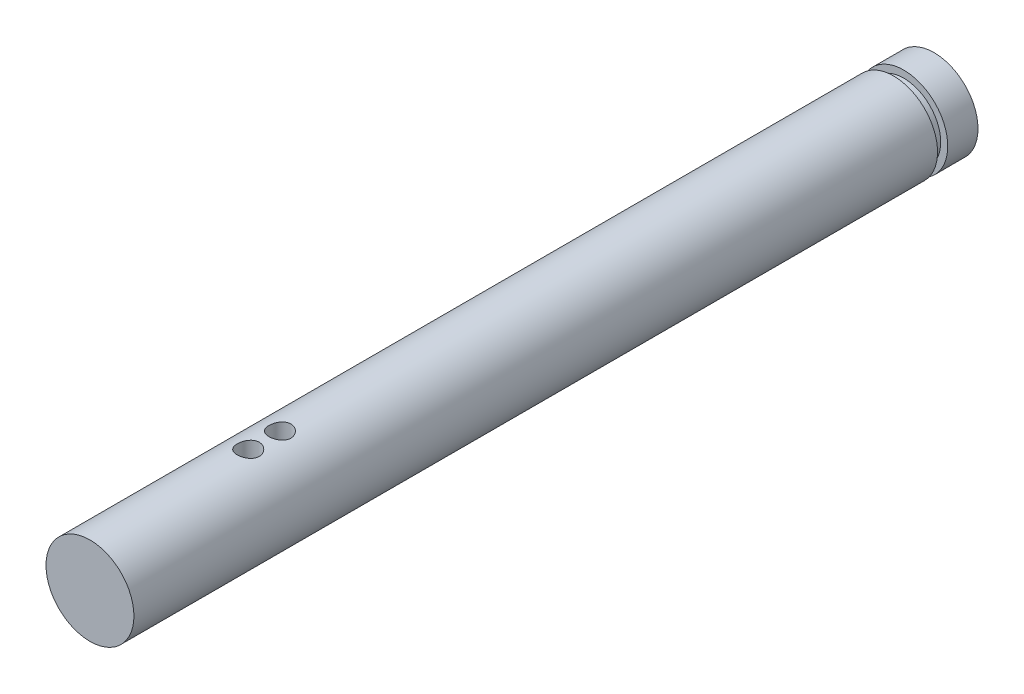
ISO-10303-21;
HEADER;
FILE_DESCRIPTION(('STEP AP214'),'2;1');
FILE_NAME('part.step','',(''),(''),'','','');
FILE_SCHEMA(('AUTOMOTIVE_DESIGN { 1 0 10303 214 1 1 1 1 }'));
ENDSEC;
DATA;
#1=APPLICATION_CONTEXT('core data for automotive mechanical design processes');
#2=APPLICATION_PROTOCOL_DEFINITION('international standard','automotive_design',2000,#1);
#3=PRODUCT_CONTEXT('',#1,'mechanical');
#4=PRODUCT('Part','Part','',(#3));
#5=PRODUCT_RELATED_PRODUCT_CATEGORY('part','',(#4));
#6=PRODUCT_DEFINITION_FORMATION('','',#4);
#7=PRODUCT_DEFINITION_CONTEXT('part definition',#1,'design');
#8=PRODUCT_DEFINITION('design','',#6,#7);
#9=PRODUCT_DEFINITION_SHAPE('','',#8);
#10=(LENGTH_UNIT() NAMED_UNIT(*) SI_UNIT(.MILLI.,.METRE.));
#11=(NAMED_UNIT(*) PLANE_ANGLE_UNIT() SI_UNIT($,.RADIAN.));
#12=(NAMED_UNIT(*) SI_UNIT($,.STERADIAN.) SOLID_ANGLE_UNIT());
#13=UNCERTAINTY_MEASURE_WITH_UNIT(LENGTH_MEASURE(1.E-05),#10,'distance_accuracy_value','');
#14=(GEOMETRIC_REPRESENTATION_CONTEXT(3) GLOBAL_UNCERTAINTY_ASSIGNED_CONTEXT((#13)) GLOBAL_UNIT_ASSIGNED_CONTEXT((#10,
#11,#12)) REPRESENTATION_CONTEXT('',''));
#15=CARTESIAN_POINT('',(0.,0.,0.));
#16=DIRECTION('',(0.,0.,1.));
#17=DIRECTION('',(1.,0.,0.));
#18=AXIS2_PLACEMENT_3D('',#15,#16,#17);
#19=CARTESIAN_POINT('',(0.,0.,35.56));
#20=DIRECTION('',(0.,0.,-1.));
#21=DIRECTION('',(-1.,0.,0.));
#22=AXIS2_PLACEMENT_3D('',#19,#20,#21);
#23=CYLINDRICAL_SURFACE('',#22,3.175);
#24=CARTESIAN_POINT('',(0.,-3.175,50.32375));
#25=CARTESIAN_POINT('',(0.0438552635877331,-3.17499925846823,50.3237487692969));
#26=CARTESIAN_POINT('',(0.0877242751854461,-3.17408230928092,50.3201032210489));
#27=CARTESIAN_POINT('',(0.174205012995241,-3.17051326901651,50.3056391907667));
#28=CARTESIAN_POINT('',(0.216816012302433,-3.167860194514,50.2948166432862));
#29=CARTESIAN_POINT('',(0.299519378196613,-3.16111268934038,50.2663675617096));
#30=CARTESIAN_POINT('',(0.339614702315041,-3.15701999003938,50.2487491981798));
#31=CARTESIAN_POINT('',(0.416280669799424,-3.14782911098185,50.2072373477679));
#32=CARTESIAN_POINT('',(0.452851194217885,-3.14273089731102,50.1833436492204));
#33=CARTESIAN_POINT('',(0.52218268653007,-3.13196506358995,50.1294395821413));
#34=CARTESIAN_POINT('',(0.554860719323982,-3.12628865866099,50.0993242915841));
#35=CARTESIAN_POINT('',(0.614758807311746,-3.11506457312193,50.034056541569));
#36=CARTESIAN_POINT('',(0.641978246218915,-3.10951690710918,49.9989035141075));
#37=CARTESIAN_POINT('',(0.690576545564486,-3.0990898547443,49.9239141925181));
#38=CARTESIAN_POINT('',(0.711862630927166,-3.09422162074029,49.8840160820295));
#39=CARTESIAN_POINT('',(0.747393364107986,-3.08583274338135,49.8010664654974));
#40=CARTESIAN_POINT('',(0.761639137669979,-3.08231188460184,49.7580154648651));
#41=CARTESIAN_POINT('',(0.782401934475602,-3.07710668929704,49.6708940655345));
#42=CARTESIAN_POINT('',(0.78906807532639,-3.07538697360746,49.626861367507));
#43=CARTESIAN_POINT('',(0.794946855973403,-3.07387287676221,49.5382716322301));
#44=CARTESIAN_POINT('',(0.794160708378678,-3.07407818237407,49.4937146814636));
#45=CARTESIAN_POINT('',(0.785276202621617,-3.07635912908627,49.4064841350685));
#46=CARTESIAN_POINT('',(0.777355538350815,-3.07838931671828,49.3637910669747));
#47=CARTESIAN_POINT('',(0.754710298902891,-3.08401883870473,49.2803597772261));
#48=CARTESIAN_POINT('',(0.739985239011734,-3.08761828484494,49.2396216950638));
#49=CARTESIAN_POINT('',(0.703997765408409,-3.09602247774299,49.1607802997333));
#50=CARTESIAN_POINT('',(0.682670861410749,-3.10083902452569,49.1227077340947));
#51=CARTESIAN_POINT('',(0.634130196057914,-3.11112805322879,49.050618016087));
#52=CARTESIAN_POINT('',(0.606915404578009,-3.11660064985464,49.0166015749811));
#53=CARTESIAN_POINT('',(0.546451062227141,-3.12777653452301,48.9525714200284));
#54=CARTESIAN_POINT('',(0.513051561612766,-3.1334819509876,48.9226994990092));
#55=CARTESIAN_POINT('',(0.441648806345707,-3.14433990118774,48.8689537591962));
#56=CARTESIAN_POINT('',(0.403645411120452,-3.14949241803232,48.8450801236188));
#57=CARTESIAN_POINT('',(0.323911324427233,-3.15868966566505,48.8039565647896));
#58=CARTESIAN_POINT('',(0.282168278906226,-3.16273053067588,48.7867296741154));
#59=CARTESIAN_POINT('',(0.196255220975606,-3.16922106074626,48.7595770923953));
#60=CARTESIAN_POINT('',(0.152085674550463,-3.17167103017036,48.7496500047287));
#61=CARTESIAN_POINT('',(0.0637857343313886,-3.17465868364436,48.7375953715584));
#62=CARTESIAN_POINT('',(0.0196832643270936,-3.17524369981464,48.7352747320352));
#63=CARTESIAN_POINT('',(-0.0682798962491322,-3.17457034214314,48.7379692635877));
#64=CARTESIAN_POINT('',(-0.112140608228599,-3.1733121342381,48.7429837743145));
#65=CARTESIAN_POINT('',(-0.19770421722756,-3.1691240334656,48.7600471056904));
#66=CARTESIAN_POINT('',(-0.239429458787632,-3.16621918923325,48.7719905852566));
#67=CARTESIAN_POINT('',(-0.320281983922786,-3.15906523927229,48.8024524986317));
#68=CARTESIAN_POINT('',(-0.359409004654768,-3.15481599779068,48.820971596449));
#69=CARTESIAN_POINT('',(-0.434722658635794,-3.14533125444339,48.8644332848629));
#70=CARTESIAN_POINT('',(-0.470844796304794,-3.14007958981668,48.8894840261433));
#71=CARTESIAN_POINT('',(-0.538441166386218,-3.12919802778343,48.9451596600717));
#72=CARTESIAN_POINT('',(-0.569914594956549,-3.12356806520694,48.9757855147139));
#73=CARTESIAN_POINT('',(-0.628115842271819,-3.11239406391741,49.0426385376135));
#74=CARTESIAN_POINT('',(-0.654708213283325,-3.10685552632436,49.0789847428388));
#75=CARTESIAN_POINT('',(-0.701416109977552,-3.09664564807955,49.1557376857381));
#76=CARTESIAN_POINT('',(-0.721531923158573,-3.09197426893801,49.1961442430662));
#77=CARTESIAN_POINT('',(-0.754565960072415,-3.0840790846376,49.2796542781102));
#78=CARTESIAN_POINT('',(-0.767526826562774,-3.08084672591967,49.3227400366654));
#79=CARTESIAN_POINT('',(-0.78599541172554,-3.07618735414389,49.410572183383));
#80=CARTESIAN_POINT('',(-0.791504760374121,-3.074759946268,49.4553182061713));
#81=CARTESIAN_POINT('',(-0.794828754051737,-3.07390218553761,49.5438223751234));
#82=CARTESIAN_POINT('',(-0.792859887575311,-3.0744156440204,49.5875719760868));
#83=CARTESIAN_POINT('',(-0.78177880977389,-3.07725185183317,49.6740941410868));
#84=CARTESIAN_POINT('',(-0.772666742005079,-3.07957456480274,49.7168667247405));
#85=CARTESIAN_POINT('',(-0.747676156538475,-3.08573625444607,49.7999853095888));
#86=CARTESIAN_POINT('',(-0.731838243310028,-3.08956612229214,49.8403442406896));
#87=CARTESIAN_POINT('',(-0.693877683449347,-3.09831187404389,49.9178608483526));
#88=CARTESIAN_POINT('',(-0.671754165143089,-3.10322790855576,49.9550180799781));
#89=CARTESIAN_POINT('',(-0.621171683653817,-3.11375231464442,50.0261226578469));
#90=CARTESIAN_POINT('',(-0.592562507041068,-3.11937540140138,50.0599609846868));
#91=CARTESIAN_POINT('',(-0.530113542254567,-3.1305924775116,50.1224269778709));
#92=CARTESIAN_POINT('',(-0.496272513750686,-3.13618645963902,50.1510534051014));
#93=CARTESIAN_POINT('',(-0.423580764630118,-3.14683592780222,50.2027884841154));
#94=CARTESIAN_POINT('',(-0.384650415142421,-3.15187982656105,50.2257878164012));
#95=CARTESIAN_POINT('',(-0.303353289824295,-3.16073856132667,50.264878865806));
#96=CARTESIAN_POINT('',(-0.260989002318608,-3.16455427751551,50.2809755325098));
#97=CARTESIAN_POINT('',(-0.182250425674669,-3.16996264853432,50.3034150935494));
#98=CARTESIAN_POINT('',(-0.146251173772186,-3.17183867923715,50.3110241994491));
#99=CARTESIAN_POINT('',(-0.0735044628546167,-3.17435761935239,50.3211919784999));
#100=CARTESIAN_POINT('',(-0.0367570603242178,-3.17500062151098,50.3237510315074));
#101=CARTESIAN_POINT('',(0.,-3.175,50.32375));
#102=B_SPLINE_CURVE_WITH_KNOTS('',3,(#24,#25,#26,#27,#28,#29,#30,#31,#32,#33,#34,#35,#36,#37,
#38,#39,#40,#41,#42,#43,#44,#45,#46,#47,#48,#49,#50,#51,#52,#53,#54,#55,#56,#57,#58,#59,#60,#61,
#62,#63,#64,#65,#66,#67,#68,#69,#70,#71,#72,#73,#74,#75,#76,#77,#78,#79,#80,#81,#82,#83,#84,#85,
#86,#87,#88,#89,#90,#91,#92,#93,#94,#95,#96,#97,#98,#99,#100,#101),.UNSPECIFIED.,.T.,.F.,(4,2,2,
2,2,2,2,2,2,2,2,2,2,2,2,2,2,2,2,2,2,2,2,2,2,2,2,2,2,2,2,2,2,2,2,2,2,2,4),(0.,0.131431089516375,
0.262936692483397,0.39428467745973,0.525637093339601,0.659418054188193,0.79321411069449,
0.928997843263224,1.06475985702124,1.19780206156782,1.33082261834635,1.46061904666214,
1.59042472250779,1.72154070999927,1.85267965567469,1.98755794262772,2.12244034891239,
2.25778604517323,2.39310583993573,2.52496271818992,2.65680772672159,2.78669895263677,
2.91660329874711,3.04881273419998,3.18104500425076,3.31652302787368,3.45199503671614,
3.58665068066593,3.72127686471065,3.85203583794265,3.98279218339235,4.11277011962706,
4.24276608972442,4.3761531751691,4.50957193170179,4.64540698160197,4.78114446688796,
4.89131103556886,5.00146931739441),.UNSPECIFIED.);
#103=CARTESIAN_POINT('',(0.,-3.175,50.32375));
#104=VERTEX_POINT('',#103);
#105=EDGE_CURVE('E10',#104,#104,#102,.T.);
#106=ORIENTED_EDGE('',*,*,#105,.T.);
#107=EDGE_LOOP('',(#106));
#108=FACE_BOUND('',#107,.T.);
#109=CARTESIAN_POINT('',(0.,3.175,50.32375));
#110=CARTESIAN_POINT('',(-0.0438552635877331,3.17499925846823,50.3237487692969));
#111=CARTESIAN_POINT('',(-0.0877242751854461,3.17408230928092,50.3201032210489));
#112=CARTESIAN_POINT('',(-0.174205012995241,3.17051326901651,50.3056391907667));
#113=CARTESIAN_POINT('',(-0.216816012302433,3.167860194514,50.2948166432862));
#114=CARTESIAN_POINT('',(-0.299519378196613,3.16111268934038,50.2663675617096));
#115=CARTESIAN_POINT('',(-0.339614702315041,3.15701999003938,50.2487491981798));
#116=CARTESIAN_POINT('',(-0.416280669799424,3.14782911098185,50.2072373477679));
#117=CARTESIAN_POINT('',(-0.452851194217885,3.14273089731102,50.1833436492204));
#118=CARTESIAN_POINT('',(-0.52218268653007,3.13196506358995,50.1294395821413));
#119=CARTESIAN_POINT('',(-0.554860719323982,3.12628865866099,50.0993242915841));
#120=CARTESIAN_POINT('',(-0.614758807311746,3.11506457312193,50.034056541569));
#121=CARTESIAN_POINT('',(-0.641978246218915,3.10951690710918,49.9989035141075));
#122=CARTESIAN_POINT('',(-0.690576545564486,3.0990898547443,49.9239141925181));
#123=CARTESIAN_POINT('',(-0.711862630927166,3.09422162074029,49.8840160820295));
#124=CARTESIAN_POINT('',(-0.747393364107986,3.08583274338135,49.8010664654974));
#125=CARTESIAN_POINT('',(-0.761639137669979,3.08231188460184,49.7580154648651));
#126=CARTESIAN_POINT('',(-0.782401934475602,3.07710668929704,49.6708940655345));
#127=CARTESIAN_POINT('',(-0.78906807532639,3.07538697360746,49.626861367507));
#128=CARTESIAN_POINT('',(-0.794946855973403,3.07387287676221,49.5382716322301));
#129=CARTESIAN_POINT('',(-0.794160708378678,3.07407818237407,49.4937146814636));
#130=CARTESIAN_POINT('',(-0.785276202621617,3.07635912908627,49.4064841350685));
#131=CARTESIAN_POINT('',(-0.777355538350815,3.07838931671828,49.3637910669747));
#132=CARTESIAN_POINT('',(-0.754710298902891,3.08401883870473,49.2803597772261));
#133=CARTESIAN_POINT('',(-0.739985239011734,3.08761828484494,49.2396216950638));
#134=CARTESIAN_POINT('',(-0.703997765408409,3.09602247774299,49.1607802997333));
#135=CARTESIAN_POINT('',(-0.682670861410749,3.10083902452569,49.1227077340947));
#136=CARTESIAN_POINT('',(-0.634130196057914,3.11112805322879,49.050618016087));
#137=CARTESIAN_POINT('',(-0.606915404578009,3.11660064985464,49.0166015749811));
#138=CARTESIAN_POINT('',(-0.546451062227141,3.12777653452301,48.9525714200284));
#139=CARTESIAN_POINT('',(-0.513051561612766,3.1334819509876,48.9226994990092));
#140=CARTESIAN_POINT('',(-0.441648806345707,3.14433990118774,48.8689537591962));
#141=CARTESIAN_POINT('',(-0.403645411120452,3.14949241803232,48.8450801236188));
#142=CARTESIAN_POINT('',(-0.323911324427233,3.15868966566505,48.8039565647896));
#143=CARTESIAN_POINT('',(-0.282168278906226,3.16273053067588,48.7867296741154));
#144=CARTESIAN_POINT('',(-0.196255220975606,3.16922106074626,48.7595770923953));
#145=CARTESIAN_POINT('',(-0.152085674550463,3.17167103017036,48.7496500047287));
#146=CARTESIAN_POINT('',(-0.0637857343313886,3.17465868364436,48.7375953715584));
#147=CARTESIAN_POINT('',(-0.0196832643270936,3.17524369981464,48.7352747320352));
#148=CARTESIAN_POINT('',(0.0682798962491322,3.17457034214314,48.7379692635877));
#149=CARTESIAN_POINT('',(0.112140608228599,3.1733121342381,48.7429837743145));
#150=CARTESIAN_POINT('',(0.19770421722756,3.1691240334656,48.7600471056904));
#151=CARTESIAN_POINT('',(0.239429458787632,3.16621918923325,48.7719905852566));
#152=CARTESIAN_POINT('',(0.320281983922786,3.15906523927229,48.8024524986317));
#153=CARTESIAN_POINT('',(0.359409004654768,3.15481599779068,48.820971596449));
#154=CARTESIAN_POINT('',(0.434722658635794,3.14533125444339,48.8644332848629));
#155=CARTESIAN_POINT('',(0.470844796304794,3.14007958981668,48.8894840261433));
#156=CARTESIAN_POINT('',(0.538441166386218,3.12919802778343,48.9451596600717));
#157=CARTESIAN_POINT('',(0.569914594956549,3.12356806520694,48.9757855147139));
#158=CARTESIAN_POINT('',(0.628115842271819,3.11239406391741,49.0426385376135));
#159=CARTESIAN_POINT('',(0.654708213283325,3.10685552632436,49.0789847428388));
#160=CARTESIAN_POINT('',(0.701416109977552,3.09664564807955,49.1557376857381));
#161=CARTESIAN_POINT('',(0.721531923158573,3.09197426893801,49.1961442430662));
#162=CARTESIAN_POINT('',(0.754565960072415,3.0840790846376,49.2796542781102));
#163=CARTESIAN_POINT('',(0.767526826562774,3.08084672591967,49.3227400366654));
#164=CARTESIAN_POINT('',(0.78599541172554,3.07618735414389,49.410572183383));
#165=CARTESIAN_POINT('',(0.791504760374121,3.074759946268,49.4553182061713));
#166=CARTESIAN_POINT('',(0.794828754051737,3.07390218553761,49.5438223751234));
#167=CARTESIAN_POINT('',(0.792859887575311,3.0744156440204,49.5875719760868));
#168=CARTESIAN_POINT('',(0.78177880977389,3.07725185183317,49.6740941410868));
#169=CARTESIAN_POINT('',(0.772666742005079,3.07957456480274,49.7168667247405));
#170=CARTESIAN_POINT('',(0.747676156538475,3.08573625444607,49.7999853095888));
#171=CARTESIAN_POINT('',(0.731838243310028,3.08956612229214,49.8403442406896));
#172=CARTESIAN_POINT('',(0.693877683449347,3.09831187404389,49.9178608483526));
#173=CARTESIAN_POINT('',(0.671754165143089,3.10322790855576,49.9550180799781));
#174=CARTESIAN_POINT('',(0.621171683653817,3.11375231464442,50.0261226578469));
#175=CARTESIAN_POINT('',(0.592562507041068,3.11937540140138,50.0599609846868));
#176=CARTESIAN_POINT('',(0.530113542254567,3.1305924775116,50.1224269778709));
#177=CARTESIAN_POINT('',(0.496272513750686,3.13618645963902,50.1510534051014));
#178=CARTESIAN_POINT('',(0.423580764630118,3.14683592780222,50.2027884841154));
#179=CARTESIAN_POINT('',(0.384650415142421,3.15187982656105,50.2257878164012));
#180=CARTESIAN_POINT('',(0.303353289824295,3.16073856132667,50.264878865806));
#181=CARTESIAN_POINT('',(0.260989002318608,3.16455427751551,50.2809755325098));
#182=CARTESIAN_POINT('',(0.182250425674669,3.16996264853432,50.3034150935494));
#183=CARTESIAN_POINT('',(0.146251173772186,3.17183867923715,50.3110241994491));
#184=CARTESIAN_POINT('',(0.0735044628546167,3.17435761935239,50.3211919784999));
#185=CARTESIAN_POINT('',(0.0367570603242178,3.17500062151098,50.3237510315074));
#186=CARTESIAN_POINT('',(0.,3.175,50.32375));
#187=B_SPLINE_CURVE_WITH_KNOTS('',3,(#109,#110,#111,#112,#113,#114,#115,#116,#117,#118,#119,
#120,#121,#122,#123,#124,#125,#126,#127,#128,#129,#130,#131,#132,#133,#134,#135,#136,#137,#138,
#139,#140,#141,#142,#143,#144,#145,#146,#147,#148,#149,#150,#151,#152,#153,#154,#155,#156,#157,
#158,#159,#160,#161,#162,#163,#164,#165,#166,#167,#168,#169,#170,#171,#172,#173,#174,#175,#176,
#177,#178,#179,#180,#181,#182,#183,#184,#185,#186),.UNSPECIFIED.,.T.,.F.,(4,2,2,2,2,2,2,2,2,2,2,
2,2,2,2,2,2,2,2,2,2,2,2,2,2,2,2,2,2,2,2,2,2,2,2,2,2,2,4),(0.,0.131431089516375,
0.262936692483397,0.39428467745973,0.525637093339601,0.659418054188193,0.79321411069449,
0.928997843263224,1.06475985702124,1.19780206156782,1.33082261834635,1.46061904666214,
1.59042472250779,1.72154070999927,1.85267965567469,1.98755794262772,2.12244034891239,
2.25778604517323,2.39310583993573,2.52496271818992,2.65680772672159,2.78669895263677,
2.91660329874711,3.04881273419998,3.18104500425076,3.31652302787368,3.45199503671614,
3.58665068066593,3.72127686471065,3.85203583794265,3.98279218339235,4.11277011962706,
4.24276608972442,4.3761531751691,4.50957193170179,4.64540698160197,4.78114446688796,
4.89131103556886,5.00146931739441),.UNSPECIFIED.);
#188=CARTESIAN_POINT('',(0.,3.175,50.32375));
#189=VERTEX_POINT('',#188);
#190=EDGE_CURVE('E44',#189,#189,#187,.T.);
#191=ORIENTED_EDGE('',*,*,#190,.T.);
#192=EDGE_LOOP('',(#191));
#193=FACE_BOUND('',#192,.T.);
#194=CARTESIAN_POINT('',(0.,-3.175,48.03775));
#195=CARTESIAN_POINT('',(0.0438552635877328,-3.17499925846823,48.0377487692969));
#196=CARTESIAN_POINT('',(0.0877242751854455,-3.17408230928092,48.0341032210489));
#197=CARTESIAN_POINT('',(0.17420501299524,-3.17051326901651,48.0196391907667));
#198=CARTESIAN_POINT('',(0.216816012302433,-3.167860194514,48.0088166432862));
#199=CARTESIAN_POINT('',(0.299519378196614,-3.16111268934038,47.9803675617096));
#200=CARTESIAN_POINT('',(0.339614702315044,-3.15701999003938,47.9627491981798));
#201=CARTESIAN_POINT('',(0.416280669799426,-3.14782911098185,47.9212373477679));
#202=CARTESIAN_POINT('',(0.452851194217886,-3.14273089731102,47.8973436492204));
#203=CARTESIAN_POINT('',(0.52218268653007,-3.13196506358995,47.8434395821413));
#204=CARTESIAN_POINT('',(0.554860719323983,-3.12628865866099,47.8133242915841));
#205=CARTESIAN_POINT('',(0.614758807311747,-3.11506457312193,47.748056541569));
#206=CARTESIAN_POINT('',(0.641978246218916,-3.10951690710918,47.7129035141075));
#207=CARTESIAN_POINT('',(0.690576545564487,-3.0990898547443,47.6379141925181));
#208=CARTESIAN_POINT('',(0.711862630927167,-3.09422162074029,47.5980160820295));
#209=CARTESIAN_POINT('',(0.747393364107986,-3.08583274338135,47.5150664654975));
#210=CARTESIAN_POINT('',(0.761639137669979,-3.08231188460184,47.4720154648651));
#211=CARTESIAN_POINT('',(0.782401934475603,-3.07710668929704,47.3848940655345));
#212=CARTESIAN_POINT('',(0.789068075326391,-3.07538697360746,47.340861367507));
#213=CARTESIAN_POINT('',(0.794946855973404,-3.07387287676221,47.2522716322301));
#214=CARTESIAN_POINT('',(0.794160708378678,-3.07407818237407,47.2077146814637));
#215=CARTESIAN_POINT('',(0.785276202621618,-3.07635912908627,47.1204841350685));
#216=CARTESIAN_POINT('',(0.777355538350815,-3.07838931671828,47.0777910669747));
#217=CARTESIAN_POINT('',(0.754710298902892,-3.08401883870473,46.9943597772261));
#218=CARTESIAN_POINT('',(0.739985239011734,-3.08761828484494,46.9536216950638));
#219=CARTESIAN_POINT('',(0.703997765408409,-3.09602247774299,46.8747802997333));
#220=CARTESIAN_POINT('',(0.682670861410748,-3.10083902452569,46.8367077340947));
#221=CARTESIAN_POINT('',(0.634130196057913,-3.11112805322879,46.764618016087));
#222=CARTESIAN_POINT('',(0.606915404578009,-3.11660064985464,46.7306015749811));
#223=CARTESIAN_POINT('',(0.546451062227143,-3.12777653452301,46.6665714200284));
#224=CARTESIAN_POINT('',(0.513051561612768,-3.1334819509876,46.6366994990092));
#225=CARTESIAN_POINT('',(0.44164880634571,-3.14433990118774,46.5829537591962));
#226=CARTESIAN_POINT('',(0.403645411120454,-3.14949241803232,46.5590801236189));
#227=CARTESIAN_POINT('',(0.323911324427235,-3.15868966566505,46.5179565647896));
#228=CARTESIAN_POINT('',(0.282168278906228,-3.16273053067588,46.5007296741154));
#229=CARTESIAN_POINT('',(0.196255220975606,-3.16922106074626,46.4735770923954));
#230=CARTESIAN_POINT('',(0.152085674550462,-3.17167103017036,46.4636500047287));
#231=CARTESIAN_POINT('',(0.0637857343313868,-3.17465868364436,46.4515953715584));
#232=CARTESIAN_POINT('',(0.0196832643270921,-3.17524369981464,46.4492747320352));
#233=CARTESIAN_POINT('',(-0.068279896249133,-3.17457034214314,46.4519692635877));
#234=CARTESIAN_POINT('',(-0.112140608228599,-3.1733121342381,46.4569837743145));
#235=CARTESIAN_POINT('',(-0.197704217227561,-3.1691240334656,46.4740471056904));
#236=CARTESIAN_POINT('',(-0.239429458787634,-3.16621918923325,46.4859905852566));
#237=CARTESIAN_POINT('',(-0.320281983922789,-3.15906523927229,46.5164524986317));
#238=CARTESIAN_POINT('',(-0.35940900465477,-3.15481599779068,46.5349715964491));
#239=CARTESIAN_POINT('',(-0.434722658635797,-3.14533125444339,46.5784332848629));
#240=CARTESIAN_POINT('',(-0.470844796304799,-3.14007958981668,46.6034840261433));
#241=CARTESIAN_POINT('',(-0.538441166386222,-3.12919802778343,46.6591596600717));
#242=CARTESIAN_POINT('',(-0.569914594956552,-3.12356806520694,46.689785514714));
#243=CARTESIAN_POINT('',(-0.62811584227182,-3.11239406391741,46.7566385376135));
#244=CARTESIAN_POINT('',(-0.654708213283326,-3.10685552632436,46.7929847428388));
#245=CARTESIAN_POINT('',(-0.701416109977552,-3.09664564807956,46.8697376857381));
#246=CARTESIAN_POINT('',(-0.721531923158574,-3.09197426893801,46.9101442430662));
#247=CARTESIAN_POINT('',(-0.754565960072417,-3.0840790846376,46.9936542781103));
#248=CARTESIAN_POINT('',(-0.767526826562776,-3.08084672591967,47.0367400366654));
#249=CARTESIAN_POINT('',(-0.785995411725541,-3.07618735414389,47.124572183383));
#250=CARTESIAN_POINT('',(-0.791504760374122,-3.074759946268,47.1693182061714));
#251=CARTESIAN_POINT('',(-0.794828754051738,-3.0739021855376,47.2578223751234));
#252=CARTESIAN_POINT('',(-0.792859887575311,-3.07441564402039,47.3015719760868));
#253=CARTESIAN_POINT('',(-0.781778809773891,-3.07725185183317,47.3880941410868));
#254=CARTESIAN_POINT('',(-0.77266674200508,-3.07957456480274,47.4308667247406));
#255=CARTESIAN_POINT('',(-0.747676156538475,-3.08573625444607,47.5139853095888));
#256=CARTESIAN_POINT('',(-0.731838243310029,-3.08956612229214,47.5543442406896));
#257=CARTESIAN_POINT('',(-0.693877683449348,-3.09831187404389,47.6318608483527));
#258=CARTESIAN_POINT('',(-0.67175416514309,-3.10322790855576,47.6690180799781));
#259=CARTESIAN_POINT('',(-0.621171683653817,-3.11375231464442,47.7401226578469));
#260=CARTESIAN_POINT('',(-0.592562507041066,-3.11937540140138,47.7739609846868));
#261=CARTESIAN_POINT('',(-0.530113542254565,-3.1305924775116,47.8364269778709));
#262=CARTESIAN_POINT('',(-0.496272513750687,-3.13618645963902,47.8650534051014));
#263=CARTESIAN_POINT('',(-0.423580764630118,-3.14683592780222,47.9167884841154));
#264=CARTESIAN_POINT('',(-0.38465041514242,-3.15187982656105,47.9397878164012));
#265=CARTESIAN_POINT('',(-0.303353289824294,-3.16073856132667,47.978878865806));
#266=CARTESIAN_POINT('',(-0.260989002318608,-3.16455427751551,47.9949755325098));
#267=CARTESIAN_POINT('',(-0.182250425674671,-3.16996264853432,48.0174150935494));
#268=CARTESIAN_POINT('',(-0.146251173772188,-3.17183867923715,48.0250241994491));
#269=CARTESIAN_POINT('',(-0.0735044628546181,-3.17435761935239,48.0351919784999));
#270=CARTESIAN_POINT('',(-0.0367570603242185,-3.17500062151098,48.0377510315074));
#271=CARTESIAN_POINT('',(0.,-3.175,48.03775));
#272=B_SPLINE_CURVE_WITH_KNOTS('',3,(#194,#195,#196,#197,#198,#199,#200,#201,#202,#203,#204,
#205,#206,#207,#208,#209,#210,#211,#212,#213,#214,#215,#216,#217,#218,#219,#220,#221,#222,#223,
#224,#225,#226,#227,#228,#229,#230,#231,#232,#233,#234,#235,#236,#237,#238,#239,#240,#241,#242,
#243,#244,#245,#246,#247,#248,#249,#250,#251,#252,#253,#254,#255,#256,#257,#258,#259,#260,#261,
#262,#263,#264,#265,#266,#267,#268,#269,#270,#271),.UNSPECIFIED.,.T.,.F.,(4,2,2,2,2,2,2,2,2,2,2,
2,2,2,2,2,2,2,2,2,2,2,2,2,2,2,2,2,2,2,2,2,2,2,2,2,2,2,4),(0.,0.131431089516374,
0.262936692483397,0.394284677459733,0.525637093339602,0.659418054188194,0.79321411069449,
0.928997843263225,1.06475985702124,1.19780206156782,1.33082261834635,1.46061904666214,
1.59042472250779,1.72154070999928,1.85267965567469,1.98755794262772,2.12244034891239,
2.25778604517323,2.39310583993573,2.52496271818992,2.65680772672159,2.78669895263678,
2.91660329874712,3.04881273419999,3.18104500425076,3.31652302787368,3.45199503671614,
3.58665068066594,3.72127686471065,3.85203583794265,3.98279218339235,4.11277011962707,
4.24276608972443,4.3761531751691,4.50957193170179,4.64540698160198,4.78114446688797,
4.89131103556886,5.00146931739441),.UNSPECIFIED.);
#273=CARTESIAN_POINT('',(0.,-3.175,48.03775));
#274=VERTEX_POINT('',#273);
#275=EDGE_CURVE('E48',#274,#274,#272,.T.);
#276=ORIENTED_EDGE('',*,*,#275,.T.);
#277=EDGE_LOOP('',(#276));
#278=FACE_BOUND('',#277,.T.);
#279=CARTESIAN_POINT('',(0.,3.175,48.03775));
#280=CARTESIAN_POINT('',(-0.0438552635877328,3.17499925846823,48.0377487692969));
#281=CARTESIAN_POINT('',(-0.0877242751854455,3.17408230928092,48.0341032210489));
#282=CARTESIAN_POINT('',(-0.17420501299524,3.17051326901651,48.0196391907667));
#283=CARTESIAN_POINT('',(-0.216816012302433,3.167860194514,48.0088166432862));
#284=CARTESIAN_POINT('',(-0.299519378196614,3.16111268934038,47.9803675617096));
#285=CARTESIAN_POINT('',(-0.339614702315044,3.15701999003938,47.9627491981798));
#286=CARTESIAN_POINT('',(-0.416280669799426,3.14782911098185,47.9212373477679));
#287=CARTESIAN_POINT('',(-0.452851194217886,3.14273089731102,47.8973436492204));
#288=CARTESIAN_POINT('',(-0.52218268653007,3.13196506358995,47.8434395821413));
#289=CARTESIAN_POINT('',(-0.554860719323983,3.12628865866099,47.8133242915841));
#290=CARTESIAN_POINT('',(-0.614758807311747,3.11506457312193,47.748056541569));
#291=CARTESIAN_POINT('',(-0.641978246218916,3.10951690710918,47.7129035141075));
#292=CARTESIAN_POINT('',(-0.690576545564487,3.0990898547443,47.6379141925181));
#293=CARTESIAN_POINT('',(-0.711862630927167,3.09422162074029,47.5980160820295));
#294=CARTESIAN_POINT('',(-0.747393364107986,3.08583274338135,47.5150664654975));
#295=CARTESIAN_POINT('',(-0.761639137669979,3.08231188460184,47.4720154648651));
#296=CARTESIAN_POINT('',(-0.782401934475603,3.07710668929704,47.3848940655345));
#297=CARTESIAN_POINT('',(-0.789068075326391,3.07538697360746,47.340861367507));
#298=CARTESIAN_POINT('',(-0.794946855973404,3.07387287676221,47.2522716322301));
#299=CARTESIAN_POINT('',(-0.794160708378678,3.07407818237407,47.2077146814637));
#300=CARTESIAN_POINT('',(-0.785276202621618,3.07635912908627,47.1204841350685));
#301=CARTESIAN_POINT('',(-0.777355538350815,3.07838931671828,47.0777910669747));
#302=CARTESIAN_POINT('',(-0.754710298902892,3.08401883870473,46.9943597772261));
#303=CARTESIAN_POINT('',(-0.739985239011734,3.08761828484494,46.9536216950638));
#304=CARTESIAN_POINT('',(-0.703997765408409,3.09602247774299,46.8747802997333));
#305=CARTESIAN_POINT('',(-0.682670861410748,3.10083902452569,46.8367077340947));
#306=CARTESIAN_POINT('',(-0.634130196057913,3.11112805322879,46.764618016087));
#307=CARTESIAN_POINT('',(-0.606915404578009,3.11660064985464,46.7306015749811));
#308=CARTESIAN_POINT('',(-0.546451062227143,3.12777653452301,46.6665714200284));
#309=CARTESIAN_POINT('',(-0.513051561612768,3.1334819509876,46.6366994990092));
#310=CARTESIAN_POINT('',(-0.44164880634571,3.14433990118774,46.5829537591962));
#311=CARTESIAN_POINT('',(-0.403645411120454,3.14949241803232,46.5590801236189));
#312=CARTESIAN_POINT('',(-0.323911324427235,3.15868966566505,46.5179565647896));
#313=CARTESIAN_POINT('',(-0.282168278906228,3.16273053067588,46.5007296741154));
#314=CARTESIAN_POINT('',(-0.196255220975606,3.16922106074626,46.4735770923954));
#315=CARTESIAN_POINT('',(-0.152085674550462,3.17167103017036,46.4636500047287));
#316=CARTESIAN_POINT('',(-0.0637857343313868,3.17465868364436,46.4515953715584));
#317=CARTESIAN_POINT('',(-0.0196832643270921,3.17524369981464,46.4492747320352));
#318=CARTESIAN_POINT('',(0.068279896249133,3.17457034214314,46.4519692635877));
#319=CARTESIAN_POINT('',(0.112140608228599,3.1733121342381,46.4569837743145));
#320=CARTESIAN_POINT('',(0.197704217227561,3.1691240334656,46.4740471056904));
#321=CARTESIAN_POINT('',(0.239429458787634,3.16621918923325,46.4859905852566));
#322=CARTESIAN_POINT('',(0.320281983922789,3.15906523927229,46.5164524986317));
#323=CARTESIAN_POINT('',(0.35940900465477,3.15481599779068,46.5349715964491));
#324=CARTESIAN_POINT('',(0.434722658635797,3.14533125444339,46.5784332848629));
#325=CARTESIAN_POINT('',(0.470844796304799,3.14007958981668,46.6034840261433));
#326=CARTESIAN_POINT('',(0.538441166386222,3.12919802778343,46.6591596600717));
#327=CARTESIAN_POINT('',(0.569914594956552,3.12356806520694,46.689785514714));
#328=CARTESIAN_POINT('',(0.62811584227182,3.11239406391741,46.7566385376135));
#329=CARTESIAN_POINT('',(0.654708213283326,3.10685552632436,46.7929847428388));
#330=CARTESIAN_POINT('',(0.701416109977552,3.09664564807956,46.8697376857381));
#331=CARTESIAN_POINT('',(0.721531923158574,3.09197426893801,46.9101442430662));
#332=CARTESIAN_POINT('',(0.754565960072417,3.0840790846376,46.9936542781103));
#333=CARTESIAN_POINT('',(0.767526826562776,3.08084672591967,47.0367400366654));
#334=CARTESIAN_POINT('',(0.785995411725541,3.07618735414389,47.124572183383));
#335=CARTESIAN_POINT('',(0.791504760374122,3.074759946268,47.1693182061714));
#336=CARTESIAN_POINT('',(0.794828754051738,3.0739021855376,47.2578223751234));
#337=CARTESIAN_POINT('',(0.792859887575311,3.07441564402039,47.3015719760868));
#338=CARTESIAN_POINT('',(0.781778809773891,3.07725185183317,47.3880941410868));
#339=CARTESIAN_POINT('',(0.77266674200508,3.07957456480274,47.4308667247406));
#340=CARTESIAN_POINT('',(0.747676156538475,3.08573625444607,47.5139853095888));
#341=CARTESIAN_POINT('',(0.731838243310029,3.08956612229214,47.5543442406896));
#342=CARTESIAN_POINT('',(0.693877683449348,3.09831187404389,47.6318608483527));
#343=CARTESIAN_POINT('',(0.67175416514309,3.10322790855576,47.6690180799781));
#344=CARTESIAN_POINT('',(0.621171683653817,3.11375231464442,47.7401226578469));
#345=CARTESIAN_POINT('',(0.592562507041066,3.11937540140138,47.7739609846868));
#346=CARTESIAN_POINT('',(0.530113542254565,3.1305924775116,47.8364269778709));
#347=CARTESIAN_POINT('',(0.496272513750687,3.13618645963902,47.8650534051014));
#348=CARTESIAN_POINT('',(0.423580764630118,3.14683592780222,47.9167884841154));
#349=CARTESIAN_POINT('',(0.38465041514242,3.15187982656105,47.9397878164012));
#350=CARTESIAN_POINT('',(0.303353289824294,3.16073856132667,47.978878865806));
#351=CARTESIAN_POINT('',(0.260989002318608,3.16455427751551,47.9949755325098));
#352=CARTESIAN_POINT('',(0.182250425674671,3.16996264853432,48.0174150935494));
#353=CARTESIAN_POINT('',(0.146251173772188,3.17183867923715,48.0250241994491));
#354=CARTESIAN_POINT('',(0.0735044628546181,3.17435761935239,48.0351919784999));
#355=CARTESIAN_POINT('',(0.0367570603242185,3.17500062151098,48.0377510315074));
#356=CARTESIAN_POINT('',(0.,3.175,48.03775));
#357=B_SPLINE_CURVE_WITH_KNOTS('',3,(#279,#280,#281,#282,#283,#284,#285,#286,#287,#288,#289,
#290,#291,#292,#293,#294,#295,#296,#297,#298,#299,#300,#301,#302,#303,#304,#305,#306,#307,#308,
#309,#310,#311,#312,#313,#314,#315,#316,#317,#318,#319,#320,#321,#322,#323,#324,#325,#326,#327,
#328,#329,#330,#331,#332,#333,#334,#335,#336,#337,#338,#339,#340,#341,#342,#343,#344,#345,#346,
#347,#348,#349,#350,#351,#352,#353,#354,#355,#356),.UNSPECIFIED.,.T.,.F.,(4,2,2,2,2,2,2,2,2,2,2,
2,2,2,2,2,2,2,2,2,2,2,2,2,2,2,2,2,2,2,2,2,2,2,2,2,2,2,4),(0.,0.131431089516374,
0.262936692483397,0.394284677459733,0.525637093339602,0.659418054188194,0.79321411069449,
0.928997843263225,1.06475985702124,1.19780206156782,1.33082261834635,1.46061904666214,
1.59042472250779,1.72154070999928,1.85267965567469,1.98755794262772,2.12244034891239,
2.25778604517323,2.39310583993573,2.52496271818992,2.65680772672159,2.78669895263678,
2.91660329874712,3.04881273419999,3.18104500425076,3.31652302787368,3.45199503671614,
3.58665068066594,3.72127686471065,3.85203583794265,3.98279218339235,4.11277011962707,
4.24276608972443,4.3761531751691,4.50957193170179,4.64540698160198,4.78114446688797,
4.89131103556886,5.00146931739441),.UNSPECIFIED.);
#358=CARTESIAN_POINT('',(0.,3.175,48.03775));
#359=VERTEX_POINT('',#358);
#360=EDGE_CURVE('E52',#359,#359,#357,.T.);
#361=ORIENTED_EDGE('',*,*,#360,.T.);
#362=EDGE_LOOP('',(#361));
#363=FACE_BOUND('',#362,.T.);
#364=CARTESIAN_POINT('',(0.,0.,2.921));
#365=DIRECTION('',(0.,0.,-1.));
#366=DIRECTION('',(-1.,0.,0.));
#367=AXIS2_PLACEMENT_3D('',#364,#365,#366);
#368=CIRCLE('',#367,3.175);
#369=CARTESIAN_POINT('',(-3.175,0.,2.921));
#370=VERTEX_POINT('',#369);
#371=EDGE_CURVE('E83',#370,#370,#368,.T.);
#372=ORIENTED_EDGE('',*,*,#371,.F.);
#373=EDGE_LOOP('',(#372));
#374=FACE_BOUND('',#373,.T.);
#375=CARTESIAN_POINT('',(0.,0.,60.96));
#376=DIRECTION('',(0.,0.,1.));
#377=DIRECTION('',(1.,0.,0.));
#378=AXIS2_PLACEMENT_3D('',#375,#376,#377);
#379=CIRCLE('',#378,3.175);
#380=CARTESIAN_POINT('',(3.175,0.,60.96));
#381=VERTEX_POINT('',#380);
#382=EDGE_CURVE('E95',#381,#381,#379,.T.);
#383=ORIENTED_EDGE('',*,*,#382,.F.);
#384=EDGE_LOOP('',(#383));
#385=FACE_BOUND('',#384,.T.);
#386=ADVANCED_FACE('F33',(#108,#193,#278,#363,#374,#385),#23,.T.);
#387=CARTESIAN_POINT('',(3.175,0.,2.921));
#388=DIRECTION('',(0.,0.,-1.));
#389=DIRECTION('',(-1.,0.,0.));
#390=AXIS2_PLACEMENT_3D('',#387,#388,#389);
#391=PLANE('',#390);
#392=ORIENTED_EDGE('',*,*,#371,.T.);
#393=EDGE_LOOP('',(#392));
#394=FACE_BOUND('',#393,.T.);
#395=CARTESIAN_POINT('',(0.,0.,2.921));
#396=DIRECTION('',(0.,0.,-1.));
#397=DIRECTION('',(-1.,0.,0.));
#398=AXIS2_PLACEMENT_3D('',#395,#396,#397);
#399=CIRCLE('',#398,2.667);
#400=CARTESIAN_POINT('',(-2.667,0.,2.921));
#401=VERTEX_POINT('',#400);
#402=EDGE_CURVE('E86',#401,#401,#399,.T.);
#403=ORIENTED_EDGE('',*,*,#402,.F.);
#404=EDGE_LOOP('',(#403));
#405=FACE_BOUND('',#404,.T.);
#406=ADVANCED_FACE('F101',(#394,#405),#391,.T.);
#407=CARTESIAN_POINT('',(0.,0.,0.));
#408=DIRECTION('',(0.,0.,-1.));
#409=DIRECTION('',(-1.,0.,0.));
#410=AXIS2_PLACEMENT_3D('',#407,#408,#409);
#411=CYLINDRICAL_SURFACE('',#410,2.667);
#412=ORIENTED_EDGE('',*,*,#402,.T.);
#413=EDGE_LOOP('',(#412));
#414=FACE_BOUND('',#413,.T.);
#415=CARTESIAN_POINT('',(0.,0.,2.1844));
#416=DIRECTION('',(0.,0.,-1.));
#417=DIRECTION('',(-1.,0.,0.));
#418=AXIS2_PLACEMENT_3D('',#415,#416,#417);
#419=CIRCLE('',#418,2.667);
#420=CARTESIAN_POINT('',(-2.667,0.,2.1844));
#421=VERTEX_POINT('',#420);
#422=EDGE_CURVE('E89',#421,#421,#419,.T.);
#423=ORIENTED_EDGE('',*,*,#422,.F.);
#424=EDGE_LOOP('',(#423));
#425=FACE_BOUND('',#424,.T.);
#426=ADVANCED_FACE('F106',(#414,#425),#411,.T.);
#427=CARTESIAN_POINT('',(3.175,0.,2.1844));
#428=DIRECTION('',(0.,0.,1.));
#429=DIRECTION('',(1.,0.,0.));
#430=AXIS2_PLACEMENT_3D('',#427,#428,#429);
#431=PLANE('',#430);
#432=ORIENTED_EDGE('',*,*,#422,.T.);
#433=EDGE_LOOP('',(#432));
#434=FACE_BOUND('',#433,.T.);
#435=CARTESIAN_POINT('',(0.,0.,2.1844));
#436=DIRECTION('',(0.,0.,-1.));
#437=DIRECTION('',(-1.,0.,0.));
#438=AXIS2_PLACEMENT_3D('',#435,#436,#437);
#439=CIRCLE('',#438,3.175);
#440=CARTESIAN_POINT('',(-3.175,0.,2.1844));
#441=VERTEX_POINT('',#440);
#442=EDGE_CURVE('E92',#441,#441,#439,.T.);
#443=ORIENTED_EDGE('',*,*,#442,.F.);
#444=EDGE_LOOP('',(#443));
#445=FACE_BOUND('',#444,.T.);
#446=ADVANCED_FACE('F116',(#434,#445),#431,.T.);
#447=CARTESIAN_POINT('',(0.,0.,0.));
#448=DIRECTION('',(0.,0.,1.));
#449=DIRECTION('',(1.,0.,0.));
#450=AXIS2_PLACEMENT_3D('',#447,#448,#449);
#451=PLANE('',#450);
#452=CARTESIAN_POINT('',(0.,0.,0.));
#453=DIRECTION('',(0.,0.,1.));
#454=DIRECTION('',(1.,0.,0.));
#455=AXIS2_PLACEMENT_3D('',#452,#453,#454);
#456=CIRCLE('',#455,3.175);
#457=CARTESIAN_POINT('',(3.175,0.,0.));
#458=VERTEX_POINT('',#457);
#459=EDGE_CURVE('E80',#458,#458,#456,.T.);
#460=ORIENTED_EDGE('',*,*,#459,.F.);
#461=EDGE_LOOP('',(#460));
#462=FACE_BOUND('',#461,.T.);
#463=ADVANCED_FACE('F110',(#462),#451,.F.);
#464=ORIENTED_EDGE('',*,*,#459,.T.);
#465=EDGE_LOOP('',(#464));
#466=FACE_BOUND('',#465,.T.);
#467=ORIENTED_EDGE('',*,*,#442,.T.);
#468=EDGE_LOOP('',(#467));
#469=FACE_BOUND('',#468,.T.);
#470=ADVANCED_FACE('F102',(#466,#469),#23,.T.);
#471=CARTESIAN_POINT('',(0.,0.,60.96));
#472=DIRECTION('',(0.,0.,1.));
#473=DIRECTION('',(1.,0.,0.));
#474=AXIS2_PLACEMENT_3D('',#471,#472,#473);
#475=PLANE('',#474);
#476=ORIENTED_EDGE('',*,*,#382,.T.);
#477=EDGE_LOOP('',(#476));
#478=FACE_BOUND('',#477,.T.);
#479=ADVANCED_FACE('F71',(#478),#475,.T.);
#480=CARTESIAN_POINT('',(0.,-3.175,47.244));
#481=DIRECTION('',(0.,1.,0.));
#482=DIRECTION('',(0.,0.,1.));
#483=AXIS2_PLACEMENT_3D('',#480,#481,#482);
#484=CYLINDRICAL_SURFACE('',#483,0.793749999999999);
#485=ORIENTED_EDGE('',*,*,#360,.F.);
#486=EDGE_LOOP('',(#485));
#487=FACE_BOUND('',#486,.T.);
#488=ORIENTED_EDGE('',*,*,#275,.F.);
#489=EDGE_LOOP('',(#488));
#490=FACE_BOUND('',#489,.T.);
#491=ADVANCED_FACE('F65',(#487,#490),#484,.F.);
#492=CARTESIAN_POINT('',(0.,-3.175,49.53));
#493=DIRECTION('',(0.,1.,0.));
#494=DIRECTION('',(0.,0.,1.));
#495=AXIS2_PLACEMENT_3D('',#492,#493,#494);
#496=CYLINDRICAL_SURFACE('',#495,0.793749999999998);
#497=ORIENTED_EDGE('',*,*,#190,.F.);
#498=EDGE_LOOP('',(#497));
#499=FACE_BOUND('',#498,.T.);
#500=ORIENTED_EDGE('',*,*,#105,.F.);
#501=EDGE_LOOP('',(#500));
#502=FACE_BOUND('',#501,.T.);
#503=ADVANCED_FACE('F62',(#499,#502),#496,.F.);
#504=CLOSED_SHELL('',(#386,#406,#426,#446,#463,#470,#479,#491,#503));
#505=MANIFOLD_SOLID_BREP('B2',#504);
#506=ADVANCED_BREP_SHAPE_REPRESENTATION('',(#18,#505),#14);
#507=SHAPE_DEFINITION_REPRESENTATION(#9,#506);
ENDSEC;
END-ISO-10303-21;
